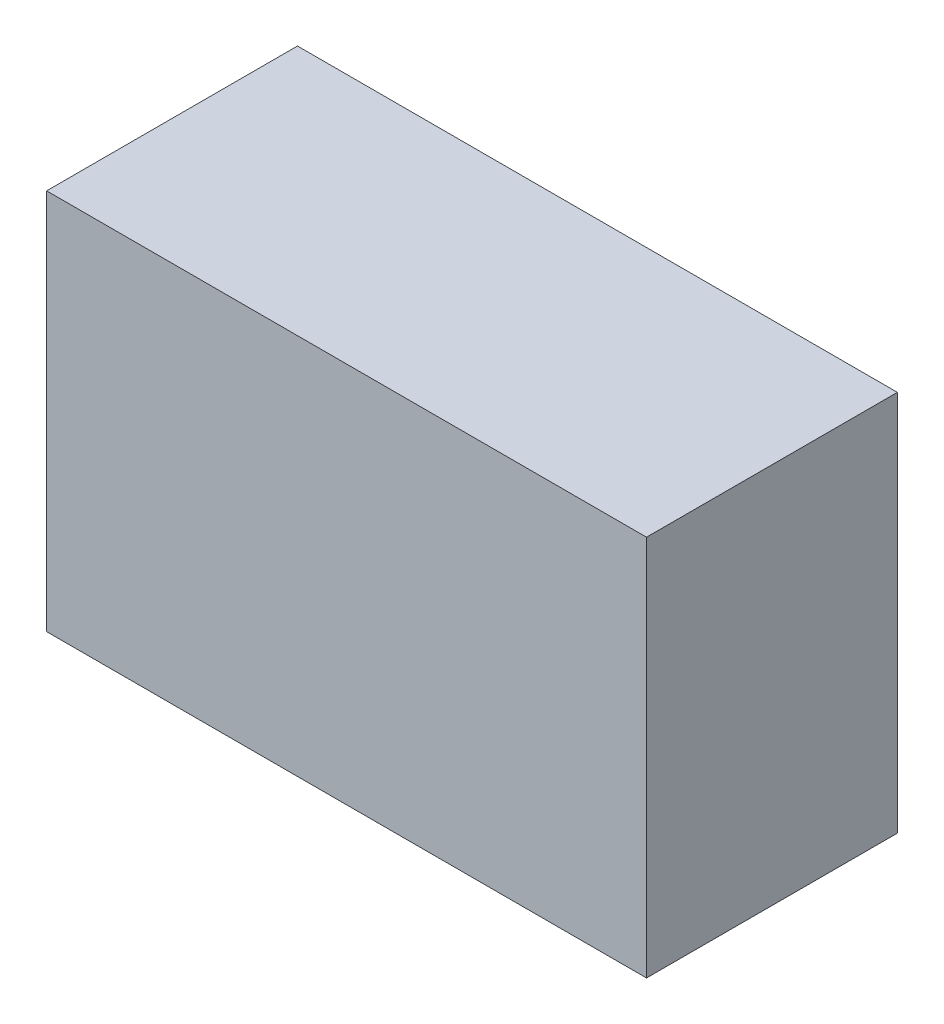
ISO-10303-21;
HEADER;
FILE_DESCRIPTION(('STEP AP214'),'2;1');
FILE_NAME('part.step','',(''),(''),'','','');
FILE_SCHEMA(('AUTOMOTIVE_DESIGN { 1 0 10303 214 1 1 1 1 }'));
ENDSEC;
DATA;
#1=APPLICATION_CONTEXT('core data for automotive mechanical design processes');
#2=APPLICATION_PROTOCOL_DEFINITION('international standard','automotive_design',2000,#1);
#3=PRODUCT_CONTEXT('',#1,'mechanical');
#4=PRODUCT('Part','Part','',(#3));
#5=PRODUCT_RELATED_PRODUCT_CATEGORY('part','',(#4));
#6=PRODUCT_DEFINITION_FORMATION('','',#4);
#7=PRODUCT_DEFINITION_CONTEXT('part definition',#1,'design');
#8=PRODUCT_DEFINITION('design','',#6,#7);
#9=PRODUCT_DEFINITION_SHAPE('','',#8);
#10=(LENGTH_UNIT() NAMED_UNIT(*) SI_UNIT(.MILLI.,.METRE.));
#11=(NAMED_UNIT(*) PLANE_ANGLE_UNIT() SI_UNIT($,.RADIAN.));
#12=(NAMED_UNIT(*) SI_UNIT($,.STERADIAN.) SOLID_ANGLE_UNIT());
#13=UNCERTAINTY_MEASURE_WITH_UNIT(LENGTH_MEASURE(1.E-05),#10,'distance_accuracy_value','');
#14=(GEOMETRIC_REPRESENTATION_CONTEXT(3) GLOBAL_UNCERTAINTY_ASSIGNED_CONTEXT((#13)) GLOBAL_UNIT_ASSIGNED_CONTEXT((#10,
#11,#12)) REPRESENTATION_CONTEXT('',''));
#15=CARTESIAN_POINT('',(0.,0.,0.));
#16=DIRECTION('',(0.,0.,1.));
#17=DIRECTION('',(1.,0.,0.));
#18=AXIS2_PLACEMENT_3D('',#15,#16,#17);
#19=CARTESIAN_POINT('',(-1.37499852,-0.87499952,1.15000024));
#20=DIRECTION('',(0.,0.,-1.));
#21=DIRECTION('',(0.,-1.,0.));
#22=AXIS2_PLACEMENT_3D('',#19,#20,#21);
#23=PLANE('',#22);
#24=DIRECTION('',(1.,0.,0.));
#25=VECTOR('',#24,1.);
#26=CARTESIAN_POINT('',(-1.37499852,-0.87499952,1.15000024));
#27=LINE('',#26,#25);
#28=CARTESIAN_POINT('',(-1.37499852,-0.87499952,1.15000024));
#29=VERTEX_POINT('',#28);
#30=CARTESIAN_POINT('',(1.37500106,-0.87499952,1.15000024));
#31=VERTEX_POINT('',#30);
#32=EDGE_CURVE('E89',#29,#31,#27,.T.);
#33=ORIENTED_EDGE('',*,*,#32,.T.);
#34=DIRECTION('',(0.,1.,0.));
#35=VECTOR('',#34,1.);
#36=CARTESIAN_POINT('',(1.37500106,-0.87499952,1.15000024));
#37=LINE('',#36,#35);
#38=CARTESIAN_POINT('',(1.37500106,0.87500206,1.15000024));
#39=VERTEX_POINT('',#38);
#40=EDGE_CURVE('E87',#31,#39,#37,.T.);
#41=ORIENTED_EDGE('',*,*,#40,.T.);
#42=DIRECTION('',(-1.,0.,0.));
#43=VECTOR('',#42,1.);
#44=CARTESIAN_POINT('',(1.37500106,0.87500206,1.15000024));
#45=LINE('',#44,#43);
#46=CARTESIAN_POINT('',(-1.37499852,0.87500206,1.15000024));
#47=VERTEX_POINT('',#46);
#48=EDGE_CURVE('E19',#39,#47,#45,.T.);
#49=ORIENTED_EDGE('',*,*,#48,.T.);
#50=DIRECTION('',(0.,-1.,0.));
#51=VECTOR('',#50,1.);
#52=CARTESIAN_POINT('',(-1.37499852,0.87500206,1.15000024));
#53=LINE('',#52,#51);
#54=EDGE_CURVE('E11',#47,#29,#53,.T.);
#55=ORIENTED_EDGE('',*,*,#54,.T.);
#56=EDGE_LOOP('',(#33,#41,#49,#55));
#57=FACE_BOUND('',#56,.T.);
#58=ADVANCED_FACE('F16',(#57),#23,.F.);
#59=CARTESIAN_POINT('',(-1.37499852,-0.87499952,0.));
#60=DIRECTION('',(0.,0.,-1.));
#61=DIRECTION('',(0.,-1.,0.));
#62=AXIS2_PLACEMENT_3D('',#59,#60,#61);
#63=PLANE('',#62);
#64=DIRECTION('',(0.,-1.,0.));
#65=VECTOR('',#64,1.);
#66=CARTESIAN_POINT('',(-1.37499852,0.87500206,0.));
#67=LINE('',#66,#65);
#68=CARTESIAN_POINT('',(-1.37499852,0.87500206,0.));
#69=VERTEX_POINT('',#68);
#70=CARTESIAN_POINT('',(-1.37499852,-0.87499952,0.));
#71=VERTEX_POINT('',#70);
#72=EDGE_CURVE('E26',#69,#71,#67,.T.);
#73=ORIENTED_EDGE('',*,*,#72,.F.);
#74=DIRECTION('',(-1.,0.,0.));
#75=VECTOR('',#74,1.);
#76=CARTESIAN_POINT('',(1.37500106,0.87500206,0.));
#77=LINE('',#76,#75);
#78=CARTESIAN_POINT('',(1.37500106,0.87500206,0.));
#79=VERTEX_POINT('',#78);
#80=EDGE_CURVE('E75',#79,#69,#77,.T.);
#81=ORIENTED_EDGE('',*,*,#80,.F.);
#82=DIRECTION('',(0.,1.,0.));
#83=VECTOR('',#82,1.);
#84=CARTESIAN_POINT('',(1.37500106,-0.87499952,0.));
#85=LINE('',#84,#83);
#86=CARTESIAN_POINT('',(1.37500106,-0.87499952,0.));
#87=VERTEX_POINT('',#86);
#88=EDGE_CURVE('E63',#87,#79,#85,.T.);
#89=ORIENTED_EDGE('',*,*,#88,.F.);
#90=DIRECTION('',(1.,0.,0.));
#91=VECTOR('',#90,1.);
#92=CARTESIAN_POINT('',(-1.37499852,-0.87499952,0.));
#93=LINE('',#92,#91);
#94=EDGE_CURVE('E107',#71,#87,#93,.T.);
#95=ORIENTED_EDGE('',*,*,#94,.F.);
#96=EDGE_LOOP('',(#73,#81,#89,#95));
#97=FACE_BOUND('',#96,.T.);
#98=ADVANCED_FACE('F146',(#97),#63,.T.);
#99=CARTESIAN_POINT('',(-1.37499852,0.87500206,0.));
#100=DIRECTION('',(1.,0.,0.));
#101=DIRECTION('',(0.,1.,0.));
#102=AXIS2_PLACEMENT_3D('',#99,#100,#101);
#103=PLANE('',#102);
#104=ORIENTED_EDGE('',*,*,#72,.T.);
#105=DIRECTION('',(0.,0.,1.));
#106=VECTOR('',#105,1.);
#107=CARTESIAN_POINT('',(-1.37499852,-0.87499952,0.));
#108=LINE('',#107,#106);
#109=EDGE_CURVE('E101',#71,#29,#108,.T.);
#110=ORIENTED_EDGE('',*,*,#109,.T.);
#111=ORIENTED_EDGE('',*,*,#54,.F.);
#112=DIRECTION('',(0.,0.,1.));
#113=VECTOR('',#112,1.);
#114=CARTESIAN_POINT('',(-1.37499852,0.87500206,0.));
#115=LINE('',#114,#113);
#116=EDGE_CURVE('E85',#69,#47,#115,.T.);
#117=ORIENTED_EDGE('',*,*,#116,.F.);
#118=EDGE_LOOP('',(#104,#110,#111,#117));
#119=FACE_BOUND('',#118,.T.);
#120=ADVANCED_FACE('F141',(#119),#103,.F.);
#121=CARTESIAN_POINT('',(1.37500106,0.87500206,0.));
#122=DIRECTION('',(0.,-1.,0.));
#123=DIRECTION('',(0.,0.,-1.));
#124=AXIS2_PLACEMENT_3D('',#121,#122,#123);
#125=PLANE('',#124);
#126=ORIENTED_EDGE('',*,*,#80,.T.);
#127=ORIENTED_EDGE('',*,*,#116,.T.);
#128=ORIENTED_EDGE('',*,*,#48,.F.);
#129=DIRECTION('',(0.,0.,1.));
#130=VECTOR('',#129,1.);
#131=CARTESIAN_POINT('',(1.37500106,0.87500206,0.));
#132=LINE('',#131,#130);
#133=EDGE_CURVE('E84',#79,#39,#132,.T.);
#134=ORIENTED_EDGE('',*,*,#133,.F.);
#135=EDGE_LOOP('',(#126,#127,#128,#134));
#136=FACE_BOUND('',#135,.T.);
#137=ADVANCED_FACE('F82',(#136),#125,.F.);
#138=CARTESIAN_POINT('',(1.37500106,-0.87499952,0.));
#139=DIRECTION('',(-1.,0.,0.));
#140=DIRECTION('',(0.,0.,1.));
#141=AXIS2_PLACEMENT_3D('',#138,#139,#140);
#142=PLANE('',#141);
#143=ORIENTED_EDGE('',*,*,#88,.T.);
#144=ORIENTED_EDGE('',*,*,#133,.T.);
#145=ORIENTED_EDGE('',*,*,#40,.F.);
#146=DIRECTION('',(0.,0.,1.));
#147=VECTOR('',#146,1.);
#148=CARTESIAN_POINT('',(1.37500106,-0.87499952,0.));
#149=LINE('',#148,#147);
#150=EDGE_CURVE('E110',#87,#31,#149,.T.);
#151=ORIENTED_EDGE('',*,*,#150,.F.);
#152=EDGE_LOOP('',(#143,#144,#145,#151));
#153=FACE_BOUND('',#152,.T.);
#154=ADVANCED_FACE('F94',(#153),#142,.F.);
#155=CARTESIAN_POINT('',(-1.37499852,-0.87499952,0.));
#156=DIRECTION('',(0.,1.,0.));
#157=DIRECTION('',(1.,0.,0.));
#158=AXIS2_PLACEMENT_3D('',#155,#156,#157);
#159=PLANE('',#158);
#160=ORIENTED_EDGE('',*,*,#94,.T.);
#161=ORIENTED_EDGE('',*,*,#150,.T.);
#162=ORIENTED_EDGE('',*,*,#32,.F.);
#163=ORIENTED_EDGE('',*,*,#109,.F.);
#164=EDGE_LOOP('',(#160,#161,#162,#163));
#165=FACE_BOUND('',#164,.T.);
#166=ADVANCED_FACE('F169',(#165),#159,.F.);
#167=CLOSED_SHELL('',(#58,#98,#120,#137,#154,#166));
#168=MANIFOLD_SOLID_BREP('B1',#167);
#169=ADVANCED_BREP_SHAPE_REPRESENTATION('',(#18,#168),#14);
#170=SHAPE_DEFINITION_REPRESENTATION(#9,#169);
ENDSEC;
END-ISO-10303-21;
